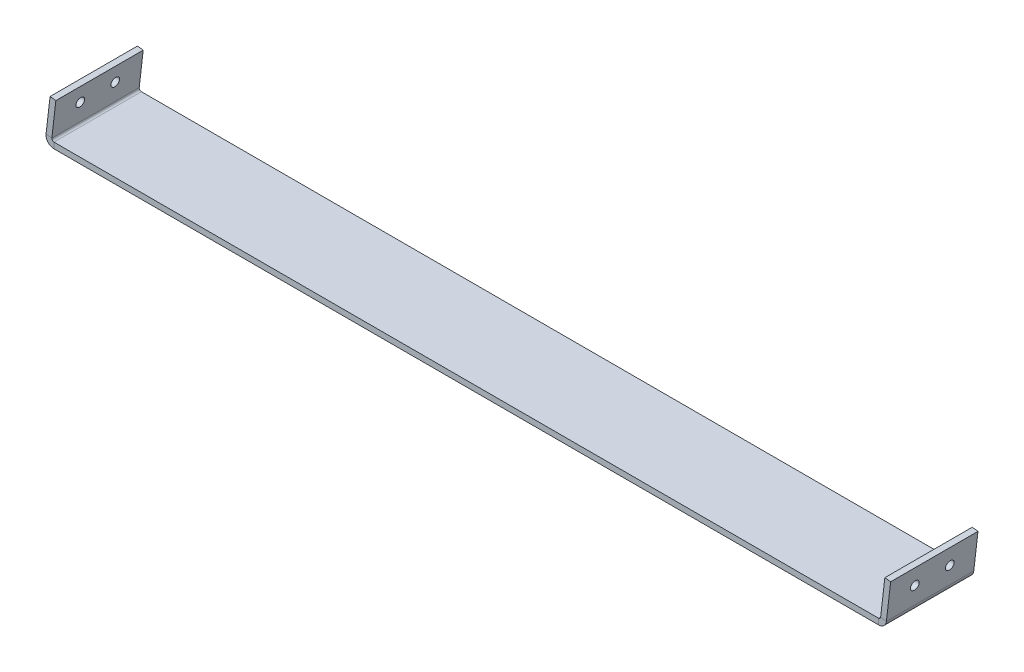
ISO-10303-21;
HEADER;
FILE_DESCRIPTION(('STEP AP214'),'2;1');
FILE_NAME('part.step','',(''),(''),'','','');
FILE_SCHEMA(('AUTOMOTIVE_DESIGN { 1 0 10303 214 1 1 1 1 }'));
ENDSEC;
DATA;
#1=APPLICATION_CONTEXT('core data for automotive mechanical design processes');
#2=APPLICATION_PROTOCOL_DEFINITION('international standard','automotive_design',2000,#1);
#3=PRODUCT_CONTEXT('',#1,'mechanical');
#4=PRODUCT('Part','Part','',(#3));
#5=PRODUCT_RELATED_PRODUCT_CATEGORY('part','',(#4));
#6=PRODUCT_DEFINITION_FORMATION('','',#4);
#7=PRODUCT_DEFINITION_CONTEXT('part definition',#1,'design');
#8=PRODUCT_DEFINITION('design','',#6,#7);
#9=PRODUCT_DEFINITION_SHAPE('','',#8);
#10=(LENGTH_UNIT() NAMED_UNIT(*) SI_UNIT(.MILLI.,.METRE.));
#11=(NAMED_UNIT(*) PLANE_ANGLE_UNIT() SI_UNIT($,.RADIAN.));
#12=(NAMED_UNIT(*) SI_UNIT($,.STERADIAN.) SOLID_ANGLE_UNIT());
#13=UNCERTAINTY_MEASURE_WITH_UNIT(LENGTH_MEASURE(1.E-05),#10,'distance_accuracy_value','');
#14=(GEOMETRIC_REPRESENTATION_CONTEXT(3) GLOBAL_UNCERTAINTY_ASSIGNED_CONTEXT((#13)) GLOBAL_UNIT_ASSIGNED_CONTEXT((#10,
#11,#12)) REPRESENTATION_CONTEXT('',''));
#15=CARTESIAN_POINT('',(0.,0.,0.));
#16=DIRECTION('',(0.,0.,1.));
#17=DIRECTION('',(1.,0.,0.));
#18=AXIS2_PLACEMENT_3D('',#15,#16,#17);
#19=CARTESIAN_POINT('',(0.,-2.,0.));
#20=DIRECTION('',(0.,1.,0.));
#21=DIRECTION('',(0.,0.,1.));
#22=AXIS2_PLACEMENT_3D('',#19,#20,#21);
#23=PLANE('',#22);
#24=DIRECTION('',(0.,0.,-1.));
#25=VECTOR('',#24,1.);
#26=CARTESIAN_POINT('',(283.92525636358,-1.99999999999999,0.));
#27=LINE('',#26,#25);
#28=CARTESIAN_POINT('',(283.92525636358,-1.99999999999999,0.));
#29=VERTEX_POINT('',#28);
#30=CARTESIAN_POINT('',(283.92525636358,-2.,30.));
#31=VERTEX_POINT('',#30);
#32=EDGE_CURVE('E137',#29,#31,#27,.F.);
#33=ORIENTED_EDGE('',*,*,#32,.T.);
#34=DIRECTION('',(1.,0.,0.));
#35=VECTOR('',#34,1.);
#36=CARTESIAN_POINT('',(0.,-2.,30.));
#37=LINE('',#36,#35);
#38=CARTESIAN_POINT('',(0.826795918296602,-2.,30.));
#39=VERTEX_POINT('',#38);
#40=EDGE_CURVE('E48',#39,#31,#37,.T.);
#41=ORIENTED_EDGE('',*,*,#40,.F.);
#42=DIRECTION('',(0.,0.,1.));
#43=VECTOR('',#42,1.);
#44=CARTESIAN_POINT('',(0.826795918296602,-2.,30.));
#45=LINE('',#44,#43);
#46=CARTESIAN_POINT('',(0.826795918296599,-2.,0.));
#47=VERTEX_POINT('',#46);
#48=EDGE_CURVE('E226',#39,#47,#45,.F.);
#49=ORIENTED_EDGE('',*,*,#48,.T.);
#50=DIRECTION('',(-1.,0.,0.));
#51=VECTOR('',#50,1.);
#52=CARTESIAN_POINT('',(0.,-2.,0.));
#53=LINE('',#52,#51);
#54=EDGE_CURVE('E11',#29,#47,#53,.T.);
#55=ORIENTED_EDGE('',*,*,#54,.F.);
#56=EDGE_LOOP('',(#33,#41,#49,#55));
#57=FACE_BOUND('',#56,.T.);
#58=ADVANCED_FACE('F39',(#57),#23,.F.);
#59=CARTESIAN_POINT('',(0.,0.,0.));
#60=DIRECTION('',(0.,1.,0.));
#61=DIRECTION('',(0.,0.,1.));
#62=AXIS2_PLACEMENT_3D('',#59,#60,#61);
#63=PLANE('',#62);
#64=DIRECTION('',(1.,0.,0.));
#65=VECTOR('',#64,1.);
#66=CARTESIAN_POINT('',(0.,0.,30.));
#67=LINE('',#66,#65);
#68=CARTESIAN_POINT('',(0.826795918296601,0.,30.));
#69=VERTEX_POINT('',#68);
#70=CARTESIAN_POINT('',(283.92525636358,0.,30.));
#71=VERTEX_POINT('',#70);
#72=EDGE_CURVE('E244',#69,#71,#67,.T.);
#73=ORIENTED_EDGE('',*,*,#72,.T.);
#74=DIRECTION('',(0.,0.,-1.));
#75=VECTOR('',#74,1.);
#76=CARTESIAN_POINT('',(283.92525636358,0.,0.));
#77=LINE('',#76,#75);
#78=CARTESIAN_POINT('',(283.92525636358,0.,0.));
#79=VERTEX_POINT('',#78);
#80=EDGE_CURVE('E187',#79,#71,#77,.F.);
#81=ORIENTED_EDGE('',*,*,#80,.F.);
#82=DIRECTION('',(-1.,0.,0.));
#83=VECTOR('',#82,1.);
#84=CARTESIAN_POINT('',(0.,0.,0.));
#85=LINE('',#84,#83);
#86=CARTESIAN_POINT('',(0.826795918296599,0.,0.));
#87=VERTEX_POINT('',#86);
#88=EDGE_CURVE('E43',#79,#87,#85,.T.);
#89=ORIENTED_EDGE('',*,*,#88,.T.);
#90=DIRECTION('',(0.,0.,1.));
#91=VECTOR('',#90,1.);
#92=CARTESIAN_POINT('',(0.826795918296603,0.,30.));
#93=LINE('',#92,#91);
#94=EDGE_CURVE('E56',#69,#87,#93,.F.);
#95=ORIENTED_EDGE('',*,*,#94,.F.);
#96=EDGE_LOOP('',(#73,#81,#89,#95));
#97=FACE_BOUND('',#96,.T.);
#98=ADVANCED_FACE('F249',(#97),#63,.T.);
#99=CARTESIAN_POINT('',(0.,-2.,0.));
#100=DIRECTION('',(0.,0.,-1.));
#101=DIRECTION('',(-1.,0.,0.));
#102=AXIS2_PLACEMENT_3D('',#99,#100,#101);
#103=PLANE('',#102);
#104=ORIENTED_EDGE('',*,*,#88,.F.);
#105=DIRECTION('',(0.,-1.,0.));
#106=VECTOR('',#105,1.);
#107=CARTESIAN_POINT('',(283.92525636358,0.,0.));
#108=LINE('',#107,#106);
#109=EDGE_CURVE('E183',#79,#29,#108,.T.);
#110=ORIENTED_EDGE('',*,*,#109,.T.);
#111=ORIENTED_EDGE('',*,*,#54,.T.);
#112=DIRECTION('',(0.,-1.,0.));
#113=VECTOR('',#112,1.);
#114=CARTESIAN_POINT('',(0.826795918296599,0.,0.));
#115=LINE('',#114,#113);
#116=EDGE_CURVE('E241',#87,#47,#115,.T.);
#117=ORIENTED_EDGE('',*,*,#116,.F.);
#118=EDGE_LOOP('',(#104,#110,#111,#117));
#119=FACE_BOUND('',#118,.T.);
#120=ADVANCED_FACE('F250',(#119),#103,.T.);
#121=CARTESIAN_POINT('',(0.,-2.,30.));
#122=DIRECTION('',(0.,0.,1.));
#123=DIRECTION('',(1.,0.,0.));
#124=AXIS2_PLACEMENT_3D('',#121,#122,#123);
#125=PLANE('',#124);
#126=DIRECTION('',(0.,-1.,0.));
#127=VECTOR('',#126,1.);
#128=CARTESIAN_POINT('',(283.92525636358,0.,30.));
#129=LINE('',#128,#127);
#130=EDGE_CURVE('E191',#71,#31,#129,.T.);
#131=ORIENTED_EDGE('',*,*,#130,.F.);
#132=ORIENTED_EDGE('',*,*,#72,.F.);
#133=DIRECTION('',(0.,-1.,0.));
#134=VECTOR('',#133,1.);
#135=CARTESIAN_POINT('',(0.826795918296603,0.,30.));
#136=LINE('',#135,#134);
#137=EDGE_CURVE('E232',#69,#39,#136,.T.);
#138=ORIENTED_EDGE('',*,*,#137,.T.);
#139=ORIENTED_EDGE('',*,*,#40,.T.);
#140=EDGE_LOOP('',(#131,#132,#138,#139));
#141=FACE_BOUND('',#140,.T.);
#142=ADVANCED_FACE('F41',(#141),#125,.T.);
#143=CARTESIAN_POINT('',(0.826795918296599,0.736600000000001,0.));
#144=DIRECTION('',(0.,0.,-1.));
#145=DIRECTION('',(-1.,0.,0.));
#146=AXIS2_PLACEMENT_3D('',#143,#144,#145);
#147=PLANE('',#146);
#148=DIRECTION('',(-0.993365278299492,0.115001842893816,0.));
#149=VECTOR('',#148,1.);
#150=CARTESIAN_POINT('',(0.0950830543011937,0.821310357475585,0.));
#151=LINE('',#150,#149);
#152=CARTESIAN_POINT('',(0.0950830543011936,0.821310357475585,0.));
#153=VERTEX_POINT('',#152);
#154=CARTESIAN_POINT('',(-1.89164750229779,1.05131404326322,0.));
#155=VERTEX_POINT('',#154);
#156=EDGE_CURVE('E194',#153,#155,#151,.T.);
#157=ORIENTED_EDGE('',*,*,#156,.F.);
#158=CARTESIAN_POINT('',(0.826795918296599,0.736600000000001,0.));
#159=DIRECTION('',(0.,0.,1.));
#160=DIRECTION('',(1.,0.,0.));
#161=AXIS2_PLACEMENT_3D('',#158,#159,#160);
#162=CIRCLE('',#161,0.7366);
#163=EDGE_CURVE('E235',#87,#153,#162,.F.);
#164=ORIENTED_EDGE('',*,*,#163,.F.);
#165=ORIENTED_EDGE('',*,*,#116,.T.);
#166=CARTESIAN_POINT('',(0.826795918296599,0.736600000000001,0.));
#167=DIRECTION('',(0.,0.,1.));
#168=DIRECTION('',(1.,0.,0.));
#169=AXIS2_PLACEMENT_3D('',#166,#167,#168);
#170=CIRCLE('',#169,2.7366);
#171=EDGE_CURVE('E228',#47,#155,#170,.F.);
#172=ORIENTED_EDGE('',*,*,#171,.T.);
#173=EDGE_LOOP('',(#157,#164,#165,#172));
#174=FACE_BOUND('',#173,.T.);
#175=ADVANCED_FACE('F258',(#174),#147,.T.);
#176=CARTESIAN_POINT('',(0.826795918296603,0.736600000000001,30.));
#177=DIRECTION('',(0.,0.,-1.));
#178=DIRECTION('',(-1.,0.,0.));
#179=AXIS2_PLACEMENT_3D('',#176,#177,#178);
#180=PLANE('',#179);
#181=CARTESIAN_POINT('',(0.826795918296603,0.736600000000001,30.));
#182=DIRECTION('',(0.,0.,1.));
#183=DIRECTION('',(1.,0.,0.));
#184=AXIS2_PLACEMENT_3D('',#181,#182,#183);
#185=CIRCLE('',#184,0.7366);
#186=CARTESIAN_POINT('',(0.095083054301198,0.821310357475585,30.));
#187=VERTEX_POINT('',#186);
#188=EDGE_CURVE('E225',#187,#69,#185,.T.);
#189=ORIENTED_EDGE('',*,*,#188,.F.);
#190=DIRECTION('',(-0.993365278299492,0.115001842893816,0.));
#191=VECTOR('',#190,1.);
#192=CARTESIAN_POINT('',(0.0950830543011974,0.821310357475586,30.));
#193=LINE('',#192,#191);
#194=CARTESIAN_POINT('',(-1.89164750229779,1.05131404326322,30.));
#195=VERTEX_POINT('',#194);
#196=EDGE_CURVE('E198',#187,#195,#193,.T.);
#197=ORIENTED_EDGE('',*,*,#196,.T.);
#198=CARTESIAN_POINT('',(0.826795918296603,0.736600000000001,30.));
#199=DIRECTION('',(0.,0.,1.));
#200=DIRECTION('',(1.,0.,0.));
#201=AXIS2_PLACEMENT_3D('',#198,#199,#200);
#202=CIRCLE('',#201,2.7366);
#203=EDGE_CURVE('E229',#195,#39,#202,.T.);
#204=ORIENTED_EDGE('',*,*,#203,.T.);
#205=ORIENTED_EDGE('',*,*,#137,.F.);
#206=EDGE_LOOP('',(#189,#197,#204,#205));
#207=FACE_BOUND('',#206,.T.);
#208=ADVANCED_FACE('F279',(#207),#180,.F.);
#209=CARTESIAN_POINT('',(0.826795918296603,0.736600000000001,30.));
#210=DIRECTION('',(0.,0.,1.));
#211=DIRECTION('',(-0.993365278299491,0.115001842893816,0.));
#212=AXIS2_PLACEMENT_3D('',#209,#210,#211);
#213=CYLINDRICAL_SURFACE('',#212,2.7366);
#214=ORIENTED_EDGE('',*,*,#48,.F.);
#215=ORIENTED_EDGE('',*,*,#203,.F.);
#216=DIRECTION('',(0.,0.,-1.));
#217=VECTOR('',#216,1.);
#218=CARTESIAN_POINT('',(-1.89164750229779,1.05131404326322,0.));
#219=LINE('',#218,#217);
#220=EDGE_CURVE('E201',#195,#155,#219,.T.);
#221=ORIENTED_EDGE('',*,*,#220,.T.);
#222=ORIENTED_EDGE('',*,*,#171,.F.);
#223=EDGE_LOOP('',(#214,#215,#221,#222));
#224=FACE_BOUND('',#223,.T.);
#225=ADVANCED_FACE('F289',(#224),#213,.T.);
#226=CARTESIAN_POINT('',(0.826795918296603,0.736600000000001,30.));
#227=DIRECTION('',(0.,0.,1.));
#228=DIRECTION('',(-0.993365278299491,0.115001842893816,0.));
#229=AXIS2_PLACEMENT_3D('',#226,#227,#228);
#230=CYLINDRICAL_SURFACE('',#229,0.7366);
#231=ORIENTED_EDGE('',*,*,#94,.T.);
#232=ORIENTED_EDGE('',*,*,#163,.T.);
#233=DIRECTION('',(0.,0.,1.));
#234=VECTOR('',#233,1.);
#235=CARTESIAN_POINT('',(0.0950830543011937,0.821310357475585,0.));
#236=LINE('',#235,#234);
#237=EDGE_CURVE('E196',#153,#187,#236,.T.);
#238=ORIENTED_EDGE('',*,*,#237,.T.);
#239=ORIENTED_EDGE('',*,*,#188,.T.);
#240=EDGE_LOOP('',(#231,#232,#238,#239));
#241=FACE_BOUND('',#240,.T.);
#242=ADVANCED_FACE('F255',(#241),#230,.F.);
#243=CARTESIAN_POINT('',(-0.51987031558434,12.9004791744924,30.));
#244=DIRECTION('',(0.,0.,-1.));
#245=DIRECTION('',(-1.,0.,0.));
#246=AXIS2_PLACEMENT_3D('',#243,#244,#245);
#247=PLANE('',#246);
#248=ORIENTED_EDGE('',*,*,#196,.F.);
#249=DIRECTION('',(0.115001842893816,0.993365278299491,0.));
#250=VECTOR('',#249,1.);
#251=CARTESIAN_POINT('',(1.46686024101464,12.6704754887047,30.));
#252=LINE('',#251,#250);
#253=CARTESIAN_POINT('',(1.46686024101464,12.6704754887047,30.));
#254=VERTEX_POINT('',#253);
#255=EDGE_CURVE('E205',#187,#254,#252,.T.);
#256=ORIENTED_EDGE('',*,*,#255,.T.);
#257=DIRECTION('',(0.993365278299492,-0.115001842893816,0.));
#258=VECTOR('',#257,1.);
#259=CARTESIAN_POINT('',(-0.51987031558434,12.9004791744924,30.));
#260=LINE('',#259,#258);
#261=CARTESIAN_POINT('',(-0.51987031558434,12.9004791744924,30.));
#262=VERTEX_POINT('',#261);
#263=EDGE_CURVE('E222',#262,#254,#260,.T.);
#264=ORIENTED_EDGE('',*,*,#263,.F.);
#265=DIRECTION('',(0.115001842893816,0.993365278299491,0.));
#266=VECTOR('',#265,1.);
#267=CARTESIAN_POINT('',(-0.51987031558434,12.9004791744924,30.));
#268=LINE('',#267,#266);
#269=EDGE_CURVE('E206',#195,#262,#268,.T.);
#270=ORIENTED_EDGE('',*,*,#269,.F.);
#271=EDGE_LOOP('',(#248,#256,#264,#270));
#272=FACE_BOUND('',#271,.T.);
#273=ADVANCED_FACE('F281',(#272),#247,.F.);
#274=CARTESIAN_POINT('',(-1.98673055659898,0.230003685787632,0.));
#275=DIRECTION('',(0.,0.,1.));
#276=DIRECTION('',(1.,0.,0.));
#277=AXIS2_PLACEMENT_3D('',#274,#275,#276);
#278=PLANE('',#277);
#279=ORIENTED_EDGE('',*,*,#156,.T.);
#280=DIRECTION('',(-0.115001842893816,-0.993365278299491,0.));
#281=VECTOR('',#280,1.);
#282=CARTESIAN_POINT('',(-1.98673055659898,0.230003685787632,0.));
#283=LINE('',#282,#281);
#284=CARTESIAN_POINT('',(-0.519870315584343,12.9004791744924,0.));
#285=VERTEX_POINT('',#284);
#286=EDGE_CURVE('E211',#285,#155,#283,.T.);
#287=ORIENTED_EDGE('',*,*,#286,.F.);
#288=DIRECTION('',(0.993365278299492,-0.115001842893816,0.));
#289=VECTOR('',#288,1.);
#290=CARTESIAN_POINT('',(-0.519870315584343,12.9004791744924,0.));
#291=LINE('',#290,#289);
#292=CARTESIAN_POINT('',(1.46686024101464,12.6704754887047,0.));
#293=VERTEX_POINT('',#292);
#294=EDGE_CURVE('E214',#285,#293,#291,.T.);
#295=ORIENTED_EDGE('',*,*,#294,.T.);
#296=DIRECTION('',(-0.115001842893816,-0.993365278299491,0.));
#297=VECTOR('',#296,1.);
#298=CARTESIAN_POINT('',(0.,0.,0.));
#299=LINE('',#298,#297);
#300=EDGE_CURVE('E209',#293,#153,#299,.T.);
#301=ORIENTED_EDGE('',*,*,#300,.T.);
#302=EDGE_LOOP('',(#279,#287,#295,#301));
#303=FACE_BOUND('',#302,.T.);
#304=ADVANCED_FACE('F261',(#303),#278,.F.);
#305=CARTESIAN_POINT('',(-1.98673055659898,0.230003685787632,0.));
#306=DIRECTION('',(0.993365278299492,-0.115001842893816,0.));
#307=DIRECTION('',(0.115001842893816,0.993365278299491,0.));
#308=AXIS2_PLACEMENT_3D('',#305,#306,#307);
#309=PLANE('',#308);
#310=CARTESIAN_POINT('',(-1.13475636655622,7.58920382640832,21.));
#311=DIRECTION('',(-0.993365278299491,0.115001842893816,0.));
#312=DIRECTION('',(-0.115001842893816,-0.993365278299492,0.));
#313=AXIS2_PLACEMENT_3D('',#310,#311,#312);
#314=CIRCLE('',#313,1.5);
#315=CARTESIAN_POINT('',(-1.30725913089695,6.09915590895909,21.));
#316=VERTEX_POINT('',#315);
#317=EDGE_CURVE('E578',#316,#316,#314,.T.);
#318=ORIENTED_EDGE('',*,*,#317,.F.);
#319=EDGE_LOOP('',(#318));
#320=FACE_BOUND('',#319,.T.);
#321=CARTESIAN_POINT('',(-1.13475636655622,7.58920382640832,9.));
#322=DIRECTION('',(-0.993365278299491,0.115001842893816,0.));
#323=DIRECTION('',(-0.115001842893816,-0.993365278299492,0.));
#324=AXIS2_PLACEMENT_3D('',#321,#322,#323);
#325=CIRCLE('',#324,1.5);
#326=CARTESIAN_POINT('',(-1.30725913089695,6.09915590895909,9.));
#327=VERTEX_POINT('',#326);
#328=EDGE_CURVE('E582',#327,#327,#325,.T.);
#329=ORIENTED_EDGE('',*,*,#328,.F.);
#330=EDGE_LOOP('',(#329));
#331=FACE_BOUND('',#330,.T.);
#332=ORIENTED_EDGE('',*,*,#220,.F.);
#333=ORIENTED_EDGE('',*,*,#269,.T.);
#334=DIRECTION('',(0.,0.,-1.));
#335=VECTOR('',#334,1.);
#336=CARTESIAN_POINT('',(-0.519870315584343,12.9004791744924,0.));
#337=LINE('',#336,#335);
#338=EDGE_CURVE('E208',#262,#285,#337,.T.);
#339=ORIENTED_EDGE('',*,*,#338,.T.);
#340=ORIENTED_EDGE('',*,*,#286,.T.);
#341=EDGE_LOOP('',(#332,#333,#339,#340));
#342=FACE_BOUND('',#341,.T.);
#343=ADVANCED_FACE('F265',(#320,#331,#342),#309,.F.);
#344=CARTESIAN_POINT('',(0.,0.,0.));
#345=DIRECTION('',(0.993365278299492,-0.115001842893816,0.));
#346=DIRECTION('',(0.115001842893816,0.993365278299491,0.));
#347=AXIS2_PLACEMENT_3D('',#344,#345,#346);
#348=PLANE('',#347);
#349=CARTESIAN_POINT('',(0.851974190042761,7.35920014062069,21.));
#350=DIRECTION('',(0.993365278299492,-0.115001842893816,0.));
#351=DIRECTION('',(0.115001842893816,0.993365278299491,0.));
#352=AXIS2_PLACEMENT_3D('',#349,#350,#351);
#353=CIRCLE('',#352,1.5);
#354=CARTESIAN_POINT('',(1.02447695438348,8.84924805806993,21.));
#355=VERTEX_POINT('',#354);
#356=EDGE_CURVE('E581',#355,#355,#353,.F.);
#357=ORIENTED_EDGE('',*,*,#356,.T.);
#358=EDGE_LOOP('',(#357));
#359=FACE_BOUND('',#358,.T.);
#360=CARTESIAN_POINT('',(0.851974190042759,7.35920014062069,9.));
#361=DIRECTION('',(0.993365278299492,-0.115001842893816,0.));
#362=DIRECTION('',(0.115001842893816,0.993365278299491,0.));
#363=AXIS2_PLACEMENT_3D('',#360,#361,#362);
#364=CIRCLE('',#363,1.5);
#365=CARTESIAN_POINT('',(1.02447695438348,8.84924805806993,9.));
#366=VERTEX_POINT('',#365);
#367=EDGE_CURVE('E585',#366,#366,#364,.F.);
#368=ORIENTED_EDGE('',*,*,#367,.T.);
#369=EDGE_LOOP('',(#368));
#370=FACE_BOUND('',#369,.T.);
#371=ORIENTED_EDGE('',*,*,#255,.F.);
#372=ORIENTED_EDGE('',*,*,#237,.F.);
#373=ORIENTED_EDGE('',*,*,#300,.F.);
#374=DIRECTION('',(0.,0.,-1.));
#375=VECTOR('',#374,1.);
#376=CARTESIAN_POINT('',(1.46686024101464,12.6704754887047,0.));
#377=LINE('',#376,#375);
#378=EDGE_CURVE('E216',#254,#293,#377,.T.);
#379=ORIENTED_EDGE('',*,*,#378,.F.);
#380=EDGE_LOOP('',(#371,#372,#373,#379));
#381=FACE_BOUND('',#380,.T.);
#382=ADVANCED_FACE('F275',(#359,#370,#381),#348,.T.);
#383=CARTESIAN_POINT('',(-0.519870315584343,12.9004791744924,0.));
#384=DIRECTION('',(-0.115001842893816,-0.993365278299492,0.));
#385=DIRECTION('',(0.993365278299492,-0.115001842893816,0.));
#386=AXIS2_PLACEMENT_3D('',#383,#384,#385);
#387=PLANE('',#386);
#388=ORIENTED_EDGE('',*,*,#378,.T.);
#389=ORIENTED_EDGE('',*,*,#294,.F.);
#390=ORIENTED_EDGE('',*,*,#338,.F.);
#391=ORIENTED_EDGE('',*,*,#263,.T.);
#392=EDGE_LOOP('',(#388,#389,#390,#391));
#393=FACE_BOUND('',#392,.T.);
#394=ADVANCED_FACE('F271',(#393),#387,.F.);
#395=CARTESIAN_POINT('',(283.92525636358,0.736600000000031,30.));
#396=DIRECTION('',(0.,0.,1.));
#397=DIRECTION('',(1.,0.,0.));
#398=AXIS2_PLACEMENT_3D('',#395,#396,#397);
#399=PLANE('',#398);
#400=DIRECTION('',(0.993365278299491,-0.115001842893822,0.));
#401=VECTOR('',#400,1.);
#402=CARTESIAN_POINT('',(284.656969227576,0.651889642524439,30.));
#403=LINE('',#402,#401);
#404=CARTESIAN_POINT('',(284.656969227576,0.651889642524439,30.));
#405=VERTEX_POINT('',#404);
#406=CARTESIAN_POINT('',(286.643699784175,0.421885956736795,30.));
#407=VERTEX_POINT('',#406);
#408=EDGE_CURVE('E314',#405,#407,#403,.T.);
#409=ORIENTED_EDGE('',*,*,#408,.F.);
#410=CARTESIAN_POINT('',(283.92525636358,0.736600000000031,30.));
#411=DIRECTION('',(0.,0.,-1.));
#412=DIRECTION('',(-1.,0.,0.));
#413=AXIS2_PLACEMENT_3D('',#410,#411,#412);
#414=CIRCLE('',#413,0.736600000000022);
#415=EDGE_CURVE('E140',#71,#405,#414,.F.);
#416=ORIENTED_EDGE('',*,*,#415,.F.);
#417=ORIENTED_EDGE('',*,*,#130,.T.);
#418=CARTESIAN_POINT('',(283.92525636358,0.736600000000031,30.));
#419=DIRECTION('',(0.,0.,-1.));
#420=DIRECTION('',(-1.,0.,0.));
#421=AXIS2_PLACEMENT_3D('',#418,#419,#420);
#422=CIRCLE('',#421,2.73660000000002);
#423=EDGE_CURVE('E182',#31,#407,#422,.F.);
#424=ORIENTED_EDGE('',*,*,#423,.T.);
#425=EDGE_LOOP('',(#409,#416,#417,#424));
#426=FACE_BOUND('',#425,.T.);
#427=ADVANCED_FACE('F312',(#426),#399,.T.);
#428=CARTESIAN_POINT('',(283.92525636358,0.736600000000031,0.));
#429=DIRECTION('',(0.,0.,1.));
#430=DIRECTION('',(1.,0.,0.));
#431=AXIS2_PLACEMENT_3D('',#428,#429,#430);
#432=PLANE('',#431);
#433=CARTESIAN_POINT('',(283.92525636358,0.736600000000031,0.));
#434=DIRECTION('',(0.,0.,-1.));
#435=DIRECTION('',(-1.,0.,0.));
#436=AXIS2_PLACEMENT_3D('',#433,#434,#435);
#437=CIRCLE('',#436,0.736600000000022);
#438=CARTESIAN_POINT('',(284.656969227576,0.651889642524439,0.));
#439=VERTEX_POINT('',#438);
#440=EDGE_CURVE('E147',#439,#79,#437,.T.);
#441=ORIENTED_EDGE('',*,*,#440,.F.);
#442=DIRECTION('',(0.993365278299491,-0.115001842893822,0.));
#443=VECTOR('',#442,1.);
#444=CARTESIAN_POINT('',(284.656969227576,0.651889642524439,0.));
#445=LINE('',#444,#443);
#446=CARTESIAN_POINT('',(286.643699784174,0.421885956736801,0.));
#447=VERTEX_POINT('',#446);
#448=EDGE_CURVE('E144',#439,#447,#445,.T.);
#449=ORIENTED_EDGE('',*,*,#448,.T.);
#450=CARTESIAN_POINT('',(283.92525636358,0.736600000000031,0.));
#451=DIRECTION('',(0.,0.,-1.));
#452=DIRECTION('',(-1.,0.,0.));
#453=AXIS2_PLACEMENT_3D('',#450,#451,#452);
#454=CIRCLE('',#453,2.73660000000002);
#455=EDGE_CURVE('E130',#447,#29,#454,.T.);
#456=ORIENTED_EDGE('',*,*,#455,.T.);
#457=ORIENTED_EDGE('',*,*,#109,.F.);
#458=EDGE_LOOP('',(#441,#449,#456,#457));
#459=FACE_BOUND('',#458,.T.);
#460=ADVANCED_FACE('F145',(#459),#432,.F.);
#461=CARTESIAN_POINT('',(283.92525636358,0.736600000000031,0.));
#462=DIRECTION('',(0.,0.,-1.));
#463=DIRECTION('',(0.993365278299491,-0.115001842893822,0.));
#464=AXIS2_PLACEMENT_3D('',#461,#462,#463);
#465=CYLINDRICAL_SURFACE('',#464,2.73660000000002);
#466=ORIENTED_EDGE('',*,*,#32,.F.);
#467=ORIENTED_EDGE('',*,*,#455,.F.);
#468=DIRECTION('',(0.,0.,1.));
#469=VECTOR('',#468,1.);
#470=CARTESIAN_POINT('',(286.643699784174,0.421885956736798,0.));
#471=LINE('',#470,#469);
#472=EDGE_CURVE('E135',#447,#407,#471,.T.);
#473=ORIENTED_EDGE('',*,*,#472,.T.);
#474=ORIENTED_EDGE('',*,*,#423,.F.);
#475=EDGE_LOOP('',(#466,#467,#473,#474));
#476=FACE_BOUND('',#475,.T.);
#477=ADVANCED_FACE('F132',(#476),#465,.T.);
#478=CARTESIAN_POINT('',(283.92525636358,0.736600000000031,0.));
#479=DIRECTION('',(0.,0.,-1.));
#480=DIRECTION('',(0.993365278299491,-0.115001842893822,0.));
#481=AXIS2_PLACEMENT_3D('',#478,#479,#480);
#482=CYLINDRICAL_SURFACE('',#481,0.736600000000022);
#483=ORIENTED_EDGE('',*,*,#80,.T.);
#484=ORIENTED_EDGE('',*,*,#415,.T.);
#485=DIRECTION('',(0.,0.,-1.));
#486=VECTOR('',#485,1.);
#487=CARTESIAN_POINT('',(284.656969227576,0.651889642524439,30.));
#488=LINE('',#487,#486);
#489=EDGE_CURVE('E151',#405,#439,#488,.T.);
#490=ORIENTED_EDGE('',*,*,#489,.T.);
#491=ORIENTED_EDGE('',*,*,#440,.T.);
#492=EDGE_LOOP('',(#483,#484,#490,#491));
#493=FACE_BOUND('',#492,.T.);
#494=ADVANCED_FACE('F317',(#493),#482,.F.);
#495=CARTESIAN_POINT('',(286.568230556599,-0.230003685787645,30.));
#496=DIRECTION('',(0.,0.,-1.));
#497=DIRECTION('',(-1.,0.,0.));
#498=AXIS2_PLACEMENT_3D('',#495,#496,#497);
#499=PLANE('',#498);
#500=ORIENTED_EDGE('',*,*,#408,.T.);
#501=DIRECTION('',(-0.115001842893822,-0.993365278299491,0.));
#502=VECTOR('',#501,1.);
#503=CARTESIAN_POINT('',(286.568230556599,-0.230003685787645,30.));
#504=LINE('',#503,#502);
#505=CARTESIAN_POINT('',(288.088345825378,12.9004791744924,30.));
#506=VERTEX_POINT('',#505);
#507=EDGE_CURVE('E159',#506,#407,#504,.T.);
#508=ORIENTED_EDGE('',*,*,#507,.F.);
#509=DIRECTION('',(-0.993365278299491,0.115001842893823,0.));
#510=VECTOR('',#509,1.);
#511=CARTESIAN_POINT('',(288.088345825378,12.9004791744924,30.));
#512=LINE('',#511,#510);
#513=CARTESIAN_POINT('',(286.101615268779,13.13048286028,30.));
#514=VERTEX_POINT('',#513);
#515=EDGE_CURVE('E168',#506,#514,#512,.T.);
#516=ORIENTED_EDGE('',*,*,#515,.T.);
#517=DIRECTION('',(-0.115001842893822,-0.993365278299491,0.));
#518=VECTOR('',#517,1.);
#519=CARTESIAN_POINT('',(284.5815,0.,30.));
#520=LINE('',#519,#518);
#521=EDGE_CURVE('E160',#514,#405,#520,.T.);
#522=ORIENTED_EDGE('',*,*,#521,.T.);
#523=EDGE_LOOP('',(#500,#508,#516,#522));
#524=FACE_BOUND('',#523,.T.);
#525=ADVANCED_FACE('F324',(#524),#499,.F.);
#526=CARTESIAN_POINT('',(288.088345825378,12.9004791744924,0.));
#527=DIRECTION('',(0.,0.,1.));
#528=DIRECTION('',(1.,0.,0.));
#529=AXIS2_PLACEMENT_3D('',#526,#527,#528);
#530=PLANE('',#529);
#531=ORIENTED_EDGE('',*,*,#448,.F.);
#532=DIRECTION('',(0.115001842893822,0.993365278299491,0.));
#533=VECTOR('',#532,1.);
#534=CARTESIAN_POINT('',(286.101615268779,13.13048286028,0.));
#535=LINE('',#534,#533);
#536=CARTESIAN_POINT('',(286.101615268779,13.13048286028,0.));
#537=VERTEX_POINT('',#536);
#538=EDGE_CURVE('E175',#439,#537,#535,.T.);
#539=ORIENTED_EDGE('',*,*,#538,.T.);
#540=DIRECTION('',(-0.993365278299491,0.115001842893823,0.));
#541=VECTOR('',#540,1.);
#542=CARTESIAN_POINT('',(288.088345825378,12.9004791744924,0.));
#543=LINE('',#542,#541);
#544=CARTESIAN_POINT('',(288.088345825378,12.9004791744924,0.));
#545=VERTEX_POINT('',#544);
#546=EDGE_CURVE('E164',#545,#537,#543,.T.);
#547=ORIENTED_EDGE('',*,*,#546,.F.);
#548=DIRECTION('',(0.115001842893822,0.993365278299491,0.));
#549=VECTOR('',#548,1.);
#550=CARTESIAN_POINT('',(288.088345825378,12.9004791744924,0.));
#551=LINE('',#550,#549);
#552=EDGE_CURVE('E156',#447,#545,#551,.T.);
#553=ORIENTED_EDGE('',*,*,#552,.F.);
#554=EDGE_LOOP('',(#531,#539,#547,#553));
#555=FACE_BOUND('',#554,.T.);
#556=ADVANCED_FACE('F162',(#555),#530,.F.);
#557=CARTESIAN_POINT('',(282.80451959383,-32.7402634685074,0.));
#558=DIRECTION('',(-0.993365278299491,0.115001842893822,0.));
#559=DIRECTION('',(-0.115001842893822,-0.993365278299491,0.));
#560=AXIS2_PLACEMENT_3D('',#557,#558,#559);
#561=PLANE('',#560);
#562=CARTESIAN_POINT('',(287.398334768015,6.94028750469542,9.));
#563=DIRECTION('',(0.993365278299491,-0.115001842893822,0.));
#564=DIRECTION('',(0.115001842893822,0.993365278299491,0.));
#565=AXIS2_PLACEMENT_3D('',#562,#563,#564);
#566=CIRCLE('',#565,1.5);
#567=CARTESIAN_POINT('',(287.570837532356,8.43033542214466,9.));
#568=VERTEX_POINT('',#567);
#569=EDGE_CURVE('E604',#568,#568,#566,.T.);
#570=ORIENTED_EDGE('',*,*,#569,.F.);
#571=EDGE_LOOP('',(#570));
#572=FACE_BOUND('',#571,.T.);
#573=CARTESIAN_POINT('',(287.398334768015,6.94028750469542,21.));
#574=DIRECTION('',(0.993365278299491,-0.115001842893822,0.));
#575=DIRECTION('',(0.115001842893822,0.993365278299491,0.));
#576=AXIS2_PLACEMENT_3D('',#573,#574,#575);
#577=CIRCLE('',#576,1.5);
#578=CARTESIAN_POINT('',(287.570837532356,8.43033542214466,21.));
#579=VERTEX_POINT('',#578);
#580=EDGE_CURVE('E598',#579,#579,#577,.T.);
#581=ORIENTED_EDGE('',*,*,#580,.F.);
#582=EDGE_LOOP('',(#581));
#583=FACE_BOUND('',#582,.T.);
#584=ORIENTED_EDGE('',*,*,#472,.F.);
#585=ORIENTED_EDGE('',*,*,#552,.T.);
#586=DIRECTION('',(0.,0.,1.));
#587=VECTOR('',#586,1.);
#588=CARTESIAN_POINT('',(288.088345825378,12.9004791744924,30.));
#589=LINE('',#588,#587);
#590=EDGE_CURVE('E166',#545,#506,#589,.T.);
#591=ORIENTED_EDGE('',*,*,#590,.T.);
#592=ORIENTED_EDGE('',*,*,#507,.T.);
#593=EDGE_LOOP('',(#584,#585,#591,#592));
#594=FACE_BOUND('',#593,.T.);
#595=ADVANCED_FACE('F155',(#572,#583,#594),#561,.F.);
#596=CARTESIAN_POINT('',(280.817789037231,-32.5102597827197,0.));
#597=DIRECTION('',(-0.993365278299491,0.115001842893822,0.));
#598=DIRECTION('',(-0.115001842893822,-0.993365278299491,0.));
#599=AXIS2_PLACEMENT_3D('',#596,#597,#598);
#600=PLANE('',#599);
#601=CARTESIAN_POINT('',(285.411604211416,7.17029119048307,9.));
#602=DIRECTION('',(-0.993365278299491,0.115001842893822,0.));
#603=DIRECTION('',(-0.115001842893822,-0.993365278299491,0.));
#604=AXIS2_PLACEMENT_3D('',#601,#602,#603);
#605=CIRCLE('',#604,1.5);
#606=CARTESIAN_POINT('',(285.239101447075,5.68024327303383,9.));
#607=VERTEX_POINT('',#606);
#608=EDGE_CURVE('E601',#607,#607,#605,.F.);
#609=ORIENTED_EDGE('',*,*,#608,.T.);
#610=EDGE_LOOP('',(#609));
#611=FACE_BOUND('',#610,.T.);
#612=CARTESIAN_POINT('',(285.411604211416,7.17029119048307,21.));
#613=DIRECTION('',(-0.993365278299491,0.115001842893822,0.));
#614=DIRECTION('',(-0.115001842893822,-0.993365278299491,0.));
#615=AXIS2_PLACEMENT_3D('',#612,#613,#614);
#616=CIRCLE('',#615,1.5);
#617=CARTESIAN_POINT('',(285.239101447075,5.68024327303383,21.));
#618=VERTEX_POINT('',#617);
#619=EDGE_CURVE('E587',#618,#618,#616,.F.);
#620=ORIENTED_EDGE('',*,*,#619,.T.);
#621=EDGE_LOOP('',(#620));
#622=FACE_BOUND('',#621,.T.);
#623=ORIENTED_EDGE('',*,*,#538,.F.);
#624=ORIENTED_EDGE('',*,*,#489,.F.);
#625=ORIENTED_EDGE('',*,*,#521,.F.);
#626=DIRECTION('',(0.,0.,1.));
#627=VECTOR('',#626,1.);
#628=CARTESIAN_POINT('',(286.101615268779,13.13048286028,30.));
#629=LINE('',#628,#627);
#630=EDGE_CURVE('E170',#537,#514,#629,.T.);
#631=ORIENTED_EDGE('',*,*,#630,.F.);
#632=EDGE_LOOP('',(#623,#624,#625,#631));
#633=FACE_BOUND('',#632,.T.);
#634=ADVANCED_FACE('F320',(#611,#622,#633),#600,.T.);
#635=CARTESIAN_POINT('',(288.088345825378,12.9004791744924,30.));
#636=DIRECTION('',(-0.115001842893823,-0.993365278299491,0.));
#637=DIRECTION('',(0.993365278299491,-0.115001842893823,0.));
#638=AXIS2_PLACEMENT_3D('',#635,#636,#637);
#639=PLANE('',#638);
#640=ORIENTED_EDGE('',*,*,#630,.T.);
#641=ORIENTED_EDGE('',*,*,#515,.F.);
#642=ORIENTED_EDGE('',*,*,#590,.F.);
#643=ORIENTED_EDGE('',*,*,#546,.T.);
#644=EDGE_LOOP('',(#640,#641,#642,#643));
#645=FACE_BOUND('',#644,.T.);
#646=ADVANCED_FACE('F327',(#645),#639,.F.);
#647=CARTESIAN_POINT('',(5.06646613692776,6.87128864286569,9.));
#648=DIRECTION('',(-0.993365278299492,0.115001842893816,0.));
#649=DIRECTION('',(-0.115001842893816,-0.993365278299492,0.));
#650=AXIS2_PLACEMENT_3D('',#647,#648,#649);
#651=CYLINDRICAL_SURFACE('',#650,1.5);
#652=ORIENTED_EDGE('',*,*,#328,.T.);
#653=EDGE_LOOP('',(#652));
#654=FACE_BOUND('',#653,.T.);
#655=ORIENTED_EDGE('',*,*,#367,.F.);
#656=EDGE_LOOP('',(#655));
#657=FACE_BOUND('',#656,.T.);
#658=ADVANCED_FACE('F329',(#654,#657),#651,.F.);
#659=CARTESIAN_POINT('',(5.06646613692776,6.87128864286569,21.));
#660=DIRECTION('',(-0.993365278299492,0.115001842893816,0.));
#661=DIRECTION('',(-0.115001842893816,-0.993365278299492,0.));
#662=AXIS2_PLACEMENT_3D('',#659,#660,#661);
#663=CYLINDRICAL_SURFACE('',#662,1.5);
#664=ORIENTED_EDGE('',*,*,#317,.T.);
#665=EDGE_LOOP('',(#664));
#666=FACE_BOUND('',#665,.T.);
#667=ORIENTED_EDGE('',*,*,#356,.F.);
#668=EDGE_LOOP('',(#667));
#669=FACE_BOUND('',#668,.T.);
#670=ADVANCED_FACE('F335',(#666,#669),#663,.F.);
#671=CARTESIAN_POINT('',(281.197112264531,7.6582026882381,21.));
#672=DIRECTION('',(0.993365278299491,-0.115001842893822,0.));
#673=DIRECTION('',(0.115001842893822,0.993365278299491,0.));
#674=AXIS2_PLACEMENT_3D('',#671,#672,#673);
#675=CYLINDRICAL_SURFACE('',#674,1.5);
#676=ORIENTED_EDGE('',*,*,#580,.T.);
#677=EDGE_LOOP('',(#676));
#678=FACE_BOUND('',#677,.T.);
#679=ORIENTED_EDGE('',*,*,#619,.F.);
#680=EDGE_LOOP('',(#679));
#681=FACE_BOUND('',#680,.T.);
#682=ADVANCED_FACE('F407',(#678,#681),#675,.F.);
#683=CARTESIAN_POINT('',(281.197112264531,7.6582026882381,9.));
#684=DIRECTION('',(0.993365278299491,-0.115001842893822,0.));
#685=DIRECTION('',(0.115001842893822,0.993365278299491,0.));
#686=AXIS2_PLACEMENT_3D('',#683,#684,#685);
#687=CYLINDRICAL_SURFACE('',#686,1.5);
#688=ORIENTED_EDGE('',*,*,#569,.T.);
#689=EDGE_LOOP('',(#688));
#690=FACE_BOUND('',#689,.T.);
#691=ORIENTED_EDGE('',*,*,#608,.F.);
#692=EDGE_LOOP('',(#691));
#693=FACE_BOUND('',#692,.T.);
#694=ADVANCED_FACE('F412',(#690,#693),#687,.F.);
#695=CLOSED_SHELL('',(#58,#98,#120,#142,#175,#208,#225,#242,#273,#304,#343,#382,#394,#427,#460,
#477,#494,#525,#556,#595,#634,#646,#658,#670,#682,#694));
#696=MANIFOLD_SOLID_BREP('B2',#695);
#697=ADVANCED_BREP_SHAPE_REPRESENTATION('',(#18,#696),#14);
#698=SHAPE_DEFINITION_REPRESENTATION(#9,#697);
ENDSEC;
END-ISO-10303-21;
